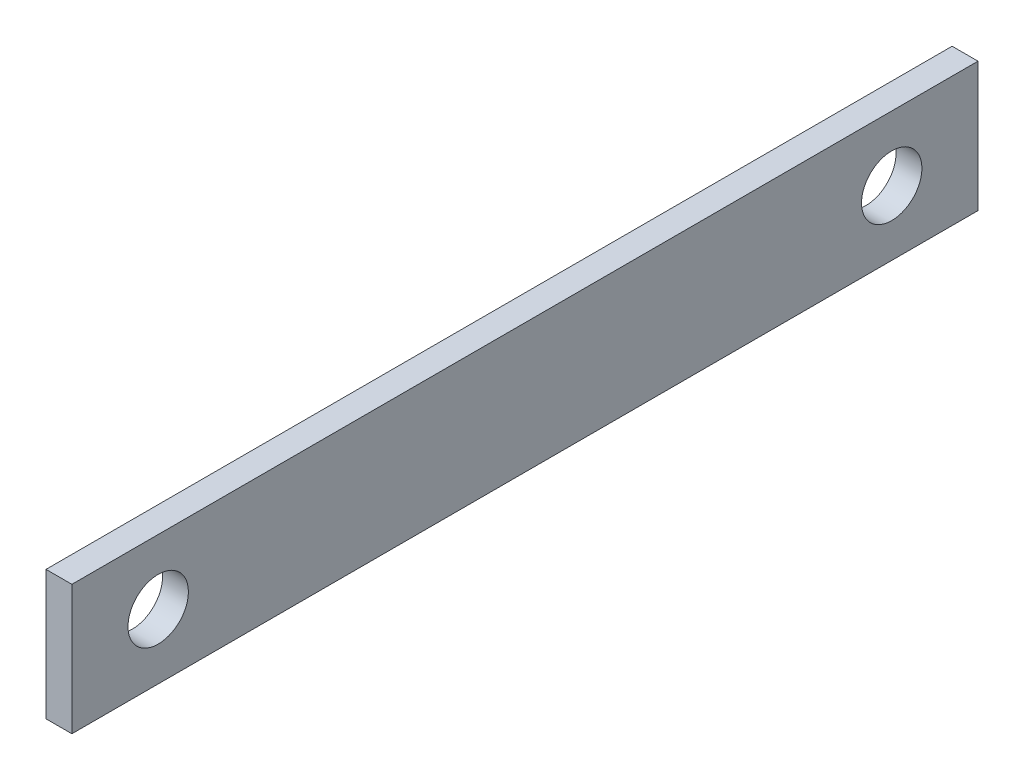
ISO-10303-21;
HEADER;
FILE_DESCRIPTION(('STEP AP214'),'2;1');
FILE_NAME('part.step','',(''),(''),'','','');
FILE_SCHEMA(('AUTOMOTIVE_DESIGN { 1 0 10303 214 1 1 1 1 }'));
ENDSEC;
DATA;
#1=APPLICATION_CONTEXT('core data for automotive mechanical design processes');
#2=APPLICATION_PROTOCOL_DEFINITION('international standard','automotive_design',2000,#1);
#3=PRODUCT_CONTEXT('',#1,'mechanical');
#4=PRODUCT('Part','Part','',(#3));
#5=PRODUCT_RELATED_PRODUCT_CATEGORY('part','',(#4));
#6=PRODUCT_DEFINITION_FORMATION('','',#4);
#7=PRODUCT_DEFINITION_CONTEXT('part definition',#1,'design');
#8=PRODUCT_DEFINITION('design','',#6,#7);
#9=PRODUCT_DEFINITION_SHAPE('','',#8);
#10=(LENGTH_UNIT() NAMED_UNIT(*) SI_UNIT(.MILLI.,.METRE.));
#11=(NAMED_UNIT(*) PLANE_ANGLE_UNIT() SI_UNIT($,.RADIAN.));
#12=(NAMED_UNIT(*) SI_UNIT($,.STERADIAN.) SOLID_ANGLE_UNIT());
#13=UNCERTAINTY_MEASURE_WITH_UNIT(LENGTH_MEASURE(1.E-05),#10,'distance_accuracy_value','');
#14=(GEOMETRIC_REPRESENTATION_CONTEXT(3) GLOBAL_UNCERTAINTY_ASSIGNED_CONTEXT((#13)) GLOBAL_UNIT_ASSIGNED_CONTEXT((#10,
#11,#12)) REPRESENTATION_CONTEXT('',''));
#15=CARTESIAN_POINT('',(0.,0.,0.));
#16=DIRECTION('',(0.,0.,1.));
#17=DIRECTION('',(1.,0.,0.));
#18=AXIS2_PLACEMENT_3D('',#15,#16,#17);
#19=CARTESIAN_POINT('',(6.,0.,0.));
#20=DIRECTION('',(-1.,0.,0.));
#21=DIRECTION('',(0.,0.,1.));
#22=AXIS2_PLACEMENT_3D('',#19,#20,#21);
#23=PLANE('',#22);
#24=DIRECTION('',(0.,1.,0.));
#25=VECTOR('',#24,1.);
#26=CARTESIAN_POINT('',(6.,-15.,-105.));
#27=LINE('',#26,#25);
#28=CARTESIAN_POINT('',(6.,-15.,-105.));
#29=VERTEX_POINT('',#28);
#30=CARTESIAN_POINT('',(6.,15.,-105.));
#31=VERTEX_POINT('',#30);
#32=EDGE_CURVE('E85',#29,#31,#27,.T.);
#33=ORIENTED_EDGE('',*,*,#32,.T.);
#34=DIRECTION('',(0.,0.,1.));
#35=VECTOR('',#34,1.);
#36=CARTESIAN_POINT('',(6.,15.,105.));
#37=LINE('',#36,#35);
#38=CARTESIAN_POINT('',(6.,15.,105.));
#39=VERTEX_POINT('',#38);
#40=EDGE_CURVE('E80',#31,#39,#37,.T.);
#41=ORIENTED_EDGE('',*,*,#40,.T.);
#42=DIRECTION('',(0.,-1.,0.));
#43=VECTOR('',#42,1.);
#44=CARTESIAN_POINT('',(6.,-15.,105.));
#45=LINE('',#44,#43);
#46=CARTESIAN_POINT('',(6.,-15.,105.));
#47=VERTEX_POINT('',#46);
#48=EDGE_CURVE('E83',#39,#47,#45,.T.);
#49=ORIENTED_EDGE('',*,*,#48,.T.);
#50=DIRECTION('',(0.,0.,-1.));
#51=VECTOR('',#50,1.);
#52=CARTESIAN_POINT('',(6.,-15.,105.));
#53=LINE('',#52,#51);
#54=EDGE_CURVE('E50',#47,#29,#53,.T.);
#55=ORIENTED_EDGE('',*,*,#54,.T.);
#56=EDGE_LOOP('',(#33,#41,#49,#55));
#57=FACE_BOUND('',#56,.T.);
#58=CARTESIAN_POINT('',(6.,0.,85.));
#59=DIRECTION('',(1.,0.,0.));
#60=DIRECTION('',(0.,0.,-1.));
#61=AXIS2_PLACEMENT_3D('',#58,#59,#60);
#62=CIRCLE('',#61,7.);
#63=CARTESIAN_POINT('',(6.,0.,78.));
#64=VERTEX_POINT('',#63);
#65=EDGE_CURVE('E100',#64,#64,#62,.T.);
#66=ORIENTED_EDGE('',*,*,#65,.F.);
#67=EDGE_LOOP('',(#66));
#68=FACE_BOUND('',#67,.T.);
#69=CARTESIAN_POINT('',(6.,0.,-85.));
#70=DIRECTION('',(1.,0.,0.));
#71=DIRECTION('',(0.,0.,-1.));
#72=AXIS2_PLACEMENT_3D('',#69,#70,#71);
#73=CIRCLE('',#72,7.);
#74=CARTESIAN_POINT('',(6.,0.,-92.));
#75=VERTEX_POINT('',#74);
#76=EDGE_CURVE('E115',#75,#75,#73,.T.);
#77=ORIENTED_EDGE('',*,*,#76,.F.);
#78=EDGE_LOOP('',(#77));
#79=FACE_BOUND('',#78,.T.);
#80=ADVANCED_FACE('F33',(#57,#68,#79),#23,.F.);
#81=CARTESIAN_POINT('',(0.,0.,0.));
#82=DIRECTION('',(-1.,0.,0.));
#83=DIRECTION('',(0.,0.,1.));
#84=AXIS2_PLACEMENT_3D('',#81,#82,#83);
#85=PLANE('',#84);
#86=CARTESIAN_POINT('',(0.,0.,85.));
#87=DIRECTION('',(1.,0.,0.));
#88=DIRECTION('',(0.,0.,-1.));
#89=AXIS2_PLACEMENT_3D('',#86,#87,#88);
#90=CIRCLE('',#89,7.);
#91=CARTESIAN_POINT('',(0.,0.,78.));
#92=VERTEX_POINT('',#91);
#93=EDGE_CURVE('E112',#92,#92,#90,.T.);
#94=ORIENTED_EDGE('',*,*,#93,.T.);
#95=EDGE_LOOP('',(#94));
#96=FACE_BOUND('',#95,.T.);
#97=DIRECTION('',(0.,1.,0.));
#98=VECTOR('',#97,1.);
#99=CARTESIAN_POINT('',(0.,-15.,-105.));
#100=LINE('',#99,#98);
#101=CARTESIAN_POINT('',(0.,-15.,-105.));
#102=VERTEX_POINT('',#101);
#103=CARTESIAN_POINT('',(0.,15.,-105.));
#104=VERTEX_POINT('',#103);
#105=EDGE_CURVE('E97',#102,#104,#100,.T.);
#106=ORIENTED_EDGE('',*,*,#105,.F.);
#107=DIRECTION('',(0.,0.,-1.));
#108=VECTOR('',#107,1.);
#109=CARTESIAN_POINT('',(0.,-15.,105.));
#110=LINE('',#109,#108);
#111=CARTESIAN_POINT('',(0.,-15.,105.));
#112=VERTEX_POINT('',#111);
#113=EDGE_CURVE('E73',#112,#102,#110,.T.);
#114=ORIENTED_EDGE('',*,*,#113,.F.);
#115=DIRECTION('',(0.,-1.,0.));
#116=VECTOR('',#115,1.);
#117=CARTESIAN_POINT('',(0.,-15.,105.));
#118=LINE('',#117,#116);
#119=CARTESIAN_POINT('',(0.,15.,105.));
#120=VERTEX_POINT('',#119);
#121=EDGE_CURVE('E67',#120,#112,#118,.T.);
#122=ORIENTED_EDGE('',*,*,#121,.F.);
#123=DIRECTION('',(0.,0.,1.));
#124=VECTOR('',#123,1.);
#125=CARTESIAN_POINT('',(0.,15.,105.));
#126=LINE('',#125,#124);
#127=EDGE_CURVE('E89',#104,#120,#126,.T.);
#128=ORIENTED_EDGE('',*,*,#127,.F.);
#129=EDGE_LOOP('',(#106,#114,#122,#128));
#130=FACE_BOUND('',#129,.T.);
#131=CARTESIAN_POINT('',(0.,0.,-85.));
#132=DIRECTION('',(1.,0.,0.));
#133=DIRECTION('',(0.,0.,-1.));
#134=AXIS2_PLACEMENT_3D('',#131,#132,#133);
#135=CIRCLE('',#134,7.);
#136=CARTESIAN_POINT('',(0.,0.,-92.));
#137=VERTEX_POINT('',#136);
#138=EDGE_CURVE('E118',#137,#137,#135,.T.);
#139=ORIENTED_EDGE('',*,*,#138,.T.);
#140=EDGE_LOOP('',(#139));
#141=FACE_BOUND('',#140,.T.);
#142=ADVANCED_FACE('F108',(#96,#130,#141),#85,.T.);
#143=CARTESIAN_POINT('',(6.,-15.,-105.));
#144=DIRECTION('',(0.,0.,1.));
#145=DIRECTION('',(1.,0.,0.));
#146=AXIS2_PLACEMENT_3D('',#143,#144,#145);
#147=PLANE('',#146);
#148=ORIENTED_EDGE('',*,*,#105,.T.);
#149=DIRECTION('',(-1.,0.,0.));
#150=VECTOR('',#149,1.);
#151=CARTESIAN_POINT('',(6.,15.,-105.));
#152=LINE('',#151,#150);
#153=EDGE_CURVE('E11',#31,#104,#152,.T.);
#154=ORIENTED_EDGE('',*,*,#153,.F.);
#155=ORIENTED_EDGE('',*,*,#32,.F.);
#156=DIRECTION('',(-1.,0.,0.));
#157=VECTOR('',#156,1.);
#158=CARTESIAN_POINT('',(6.,-15.,-105.));
#159=LINE('',#158,#157);
#160=EDGE_CURVE('E93',#29,#102,#159,.T.);
#161=ORIENTED_EDGE('',*,*,#160,.T.);
#162=EDGE_LOOP('',(#148,#154,#155,#161));
#163=FACE_BOUND('',#162,.T.);
#164=ADVANCED_FACE('F35',(#163),#147,.F.);
#165=CARTESIAN_POINT('',(6.,15.,105.));
#166=DIRECTION('',(0.,-1.,0.));
#167=DIRECTION('',(0.,0.,-1.));
#168=AXIS2_PLACEMENT_3D('',#165,#166,#167);
#169=PLANE('',#168);
#170=ORIENTED_EDGE('',*,*,#127,.T.);
#171=DIRECTION('',(-1.,0.,0.));
#172=VECTOR('',#171,1.);
#173=CARTESIAN_POINT('',(6.,15.,105.));
#174=LINE('',#173,#172);
#175=EDGE_CURVE('E42',#39,#120,#174,.T.);
#176=ORIENTED_EDGE('',*,*,#175,.F.);
#177=ORIENTED_EDGE('',*,*,#40,.F.);
#178=ORIENTED_EDGE('',*,*,#153,.T.);
#179=EDGE_LOOP('',(#170,#176,#177,#178));
#180=FACE_BOUND('',#179,.T.);
#181=ADVANCED_FACE('F88',(#180),#169,.F.);
#182=CARTESIAN_POINT('',(6.,-15.,105.));
#183=DIRECTION('',(0.,0.,-1.));
#184=DIRECTION('',(-1.,0.,0.));
#185=AXIS2_PLACEMENT_3D('',#182,#183,#184);
#186=PLANE('',#185);
#187=ORIENTED_EDGE('',*,*,#121,.T.);
#188=DIRECTION('',(-1.,0.,0.));
#189=VECTOR('',#188,1.);
#190=CARTESIAN_POINT('',(6.,-15.,105.));
#191=LINE('',#190,#189);
#192=EDGE_CURVE('E90',#47,#112,#191,.T.);
#193=ORIENTED_EDGE('',*,*,#192,.F.);
#194=ORIENTED_EDGE('',*,*,#48,.F.);
#195=ORIENTED_EDGE('',*,*,#175,.T.);
#196=EDGE_LOOP('',(#187,#193,#194,#195));
#197=FACE_BOUND('',#196,.T.);
#198=ADVANCED_FACE('F91',(#197),#186,.F.);
#199=CARTESIAN_POINT('',(6.,-15.,105.));
#200=DIRECTION('',(0.,1.,0.));
#201=DIRECTION('',(0.,0.,1.));
#202=AXIS2_PLACEMENT_3D('',#199,#200,#201);
#203=PLANE('',#202);
#204=ORIENTED_EDGE('',*,*,#113,.T.);
#205=ORIENTED_EDGE('',*,*,#160,.F.);
#206=ORIENTED_EDGE('',*,*,#54,.F.);
#207=ORIENTED_EDGE('',*,*,#192,.T.);
#208=EDGE_LOOP('',(#204,#205,#206,#207));
#209=FACE_BOUND('',#208,.T.);
#210=ADVANCED_FACE('F105',(#209),#203,.F.);
#211=CARTESIAN_POINT('',(6.,0.,85.));
#212=DIRECTION('',(-1.,0.,0.));
#213=DIRECTION('',(0.,0.,1.));
#214=AXIS2_PLACEMENT_3D('',#211,#212,#213);
#215=CYLINDRICAL_SURFACE('',#214,7.);
#216=ORIENTED_EDGE('',*,*,#65,.T.);
#217=EDGE_LOOP('',(#216));
#218=FACE_BOUND('',#217,.T.);
#219=ORIENTED_EDGE('',*,*,#93,.F.);
#220=EDGE_LOOP('',(#219));
#221=FACE_BOUND('',#220,.T.);
#222=ADVANCED_FACE('F135',(#218,#221),#215,.F.);
#223=CARTESIAN_POINT('',(6.,0.,-85.));
#224=DIRECTION('',(-1.,0.,0.));
#225=DIRECTION('',(0.,0.,1.));
#226=AXIS2_PLACEMENT_3D('',#223,#224,#225);
#227=CYLINDRICAL_SURFACE('',#226,7.);
#228=ORIENTED_EDGE('',*,*,#76,.T.);
#229=EDGE_LOOP('',(#228));
#230=FACE_BOUND('',#229,.T.);
#231=ORIENTED_EDGE('',*,*,#138,.F.);
#232=EDGE_LOOP('',(#231));
#233=FACE_BOUND('',#232,.T.);
#234=ADVANCED_FACE('F124',(#230,#233),#227,.F.);
#235=CLOSED_SHELL('',(#80,#142,#164,#181,#198,#210,#222,#234));
#236=MANIFOLD_SOLID_BREP('B2',#235);
#237=ADVANCED_BREP_SHAPE_REPRESENTATION('',(#18,#236),#14);
#238=SHAPE_DEFINITION_REPRESENTATION(#9,#237);
ENDSEC;
END-ISO-10303-21;
